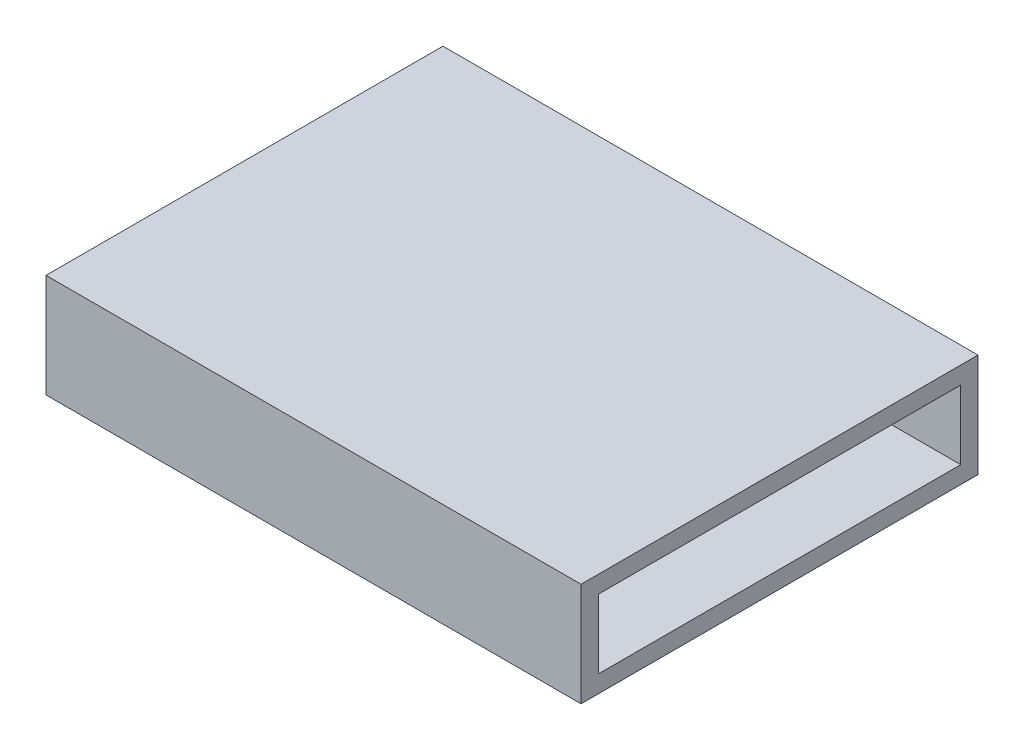
ISO-10303-21;
HEADER;
FILE_DESCRIPTION(('STEP AP214'),'2;1');
FILE_NAME('part.step','',(''),(''),'','','');
FILE_SCHEMA(('AUTOMOTIVE_DESIGN { 1 0 10303 214 1 1 1 1 }'));
ENDSEC;
DATA;
#1=APPLICATION_CONTEXT('core data for automotive mechanical design processes');
#2=APPLICATION_PROTOCOL_DEFINITION('international standard','automotive_design',2000,#1);
#3=PRODUCT_CONTEXT('',#1,'mechanical');
#4=PRODUCT('Part','Part','',(#3));
#5=PRODUCT_RELATED_PRODUCT_CATEGORY('part','',(#4));
#6=PRODUCT_DEFINITION_FORMATION('','',#4);
#7=PRODUCT_DEFINITION_CONTEXT('part definition',#1,'design');
#8=PRODUCT_DEFINITION('design','',#6,#7);
#9=PRODUCT_DEFINITION_SHAPE('','',#8);
#10=(LENGTH_UNIT() NAMED_UNIT(*) SI_UNIT(.MILLI.,.METRE.));
#11=(NAMED_UNIT(*) PLANE_ANGLE_UNIT() SI_UNIT($,.RADIAN.));
#12=(NAMED_UNIT(*) SI_UNIT($,.STERADIAN.) SOLID_ANGLE_UNIT());
#13=UNCERTAINTY_MEASURE_WITH_UNIT(LENGTH_MEASURE(1.E-05),#10,'distance_accuracy_value','');
#14=(GEOMETRIC_REPRESENTATION_CONTEXT(3) GLOBAL_UNCERTAINTY_ASSIGNED_CONTEXT((#13)) GLOBAL_UNIT_ASSIGNED_CONTEXT((#10,
#11,#12)) REPRESENTATION_CONTEXT('',''));
#15=CARTESIAN_POINT('',(0.,0.,0.));
#16=DIRECTION('',(0.,0.,1.));
#17=DIRECTION('',(1.,0.,0.));
#18=AXIS2_PLACEMENT_3D('',#15,#16,#17);
#19=CARTESIAN_POINT('',(0.,30.,0.));
#20=DIRECTION('',(1.,0.,0.));
#21=DIRECTION('',(0.,0.,-1.));
#22=AXIS2_PLACEMENT_3D('',#19,#20,#21);
#23=PLANE('',#22);
#24=DIRECTION('',(0.,-1.,0.));
#25=VECTOR('',#24,1.);
#26=CARTESIAN_POINT('',(0.,25.,-5.));
#27=LINE('',#26,#25);
#28=CARTESIAN_POINT('',(0.,25.,-5.));
#29=VERTEX_POINT('',#28);
#30=CARTESIAN_POINT('',(0.,5.,-5.));
#31=VERTEX_POINT('',#30);
#32=EDGE_CURVE('E118',#29,#31,#27,.T.);
#33=ORIENTED_EDGE('',*,*,#32,.T.);
#34=DIRECTION('',(0.,0.,-1.));
#35=VECTOR('',#34,1.);
#36=CARTESIAN_POINT('',(0.,5.,-5.));
#37=LINE('',#36,#35);
#38=CARTESIAN_POINT('',(0.,5.,-110.));
#39=VERTEX_POINT('',#38);
#40=EDGE_CURVE('E115',#31,#39,#37,.T.);
#41=ORIENTED_EDGE('',*,*,#40,.T.);
#42=DIRECTION('',(0.,1.,0.));
#43=VECTOR('',#42,1.);
#44=CARTESIAN_POINT('',(0.,5.,-110.));
#45=LINE('',#44,#43);
#46=CARTESIAN_POINT('',(0.,25.,-110.));
#47=VERTEX_POINT('',#46);
#48=EDGE_CURVE('E121',#39,#47,#45,.T.);
#49=ORIENTED_EDGE('',*,*,#48,.T.);
#50=DIRECTION('',(0.,0.,1.));
#51=VECTOR('',#50,1.);
#52=CARTESIAN_POINT('',(0.,25.,-110.));
#53=LINE('',#52,#51);
#54=EDGE_CURVE('E58',#47,#29,#53,.T.);
#55=ORIENTED_EDGE('',*,*,#54,.T.);
#56=EDGE_LOOP('',(#33,#41,#49,#55));
#57=FACE_BOUND('',#56,.T.);
#58=DIRECTION('',(0.,0.,1.));
#59=VECTOR('',#58,1.);
#60=CARTESIAN_POINT('',(0.,0.,0.));
#61=LINE('',#60,#59);
#62=CARTESIAN_POINT('',(0.,0.,-115.));
#63=VERTEX_POINT('',#62);
#64=CARTESIAN_POINT('',(0.,0.,0.));
#65=VERTEX_POINT('',#64);
#66=EDGE_CURVE('E153',#63,#65,#61,.T.);
#67=ORIENTED_EDGE('',*,*,#66,.T.);
#68=DIRECTION('',(0.,-1.,0.));
#69=VECTOR('',#68,1.);
#70=CARTESIAN_POINT('',(0.,30.,0.));
#71=LINE('',#70,#69);
#72=CARTESIAN_POINT('',(0.,30.,0.));
#73=VERTEX_POINT('',#72);
#74=EDGE_CURVE('E11',#73,#65,#71,.T.);
#75=ORIENTED_EDGE('',*,*,#74,.F.);
#76=DIRECTION('',(0.,0.,1.));
#77=VECTOR('',#76,1.);
#78=CARTESIAN_POINT('',(0.,30.,0.));
#79=LINE('',#78,#77);
#80=CARTESIAN_POINT('',(0.,30.,-115.));
#81=VERTEX_POINT('',#80);
#82=EDGE_CURVE('E157',#81,#73,#79,.T.);
#83=ORIENTED_EDGE('',*,*,#82,.F.);
#84=DIRECTION('',(0.,-1.,0.));
#85=VECTOR('',#84,1.);
#86=CARTESIAN_POINT('',(0.,30.,-115.));
#87=LINE('',#86,#85);
#88=EDGE_CURVE('E175',#81,#63,#87,.T.);
#89=ORIENTED_EDGE('',*,*,#88,.T.);
#90=EDGE_LOOP('',(#67,#75,#83,#89));
#91=FACE_BOUND('',#90,.T.);
#92=ADVANCED_FACE('F44',(#57,#91),#23,.F.);
#93=CARTESIAN_POINT('',(0.,30.,0.));
#94=DIRECTION('',(0.,0.,-1.));
#95=DIRECTION('',(-1.,0.,0.));
#96=AXIS2_PLACEMENT_3D('',#93,#94,#95);
#97=PLANE('',#96);
#98=DIRECTION('',(1.,0.,0.));
#99=VECTOR('',#98,1.);
#100=CARTESIAN_POINT('',(0.,0.,0.));
#101=LINE('',#100,#99);
#102=CARTESIAN_POINT('',(155.,0.,0.));
#103=VERTEX_POINT('',#102);
#104=EDGE_CURVE('E176',#65,#103,#101,.T.);
#105=ORIENTED_EDGE('',*,*,#104,.T.);
#106=DIRECTION('',(0.,-1.,0.));
#107=VECTOR('',#106,1.);
#108=CARTESIAN_POINT('',(155.,30.,0.));
#109=LINE('',#108,#107);
#110=CARTESIAN_POINT('',(155.,30.,0.));
#111=VERTEX_POINT('',#110);
#112=EDGE_CURVE('E52',#111,#103,#109,.T.);
#113=ORIENTED_EDGE('',*,*,#112,.F.);
#114=DIRECTION('',(1.,0.,0.));
#115=VECTOR('',#114,1.);
#116=CARTESIAN_POINT('',(0.,30.,0.));
#117=LINE('',#116,#115);
#118=EDGE_CURVE('E162',#73,#111,#117,.T.);
#119=ORIENTED_EDGE('',*,*,#118,.F.);
#120=ORIENTED_EDGE('',*,*,#74,.T.);
#121=EDGE_LOOP('',(#105,#113,#119,#120));
#122=FACE_BOUND('',#121,.T.);
#123=ADVANCED_FACE('F211',(#122),#97,.F.);
#124=CARTESIAN_POINT('',(155.,30.,0.));
#125=DIRECTION('',(-1.,0.,0.));
#126=DIRECTION('',(0.,0.,1.));
#127=AXIS2_PLACEMENT_3D('',#124,#125,#126);
#128=PLANE('',#127);
#129=DIRECTION('',(0.,1.,0.));
#130=VECTOR('',#129,1.);
#131=CARTESIAN_POINT('',(155.,5.,-110.));
#132=LINE('',#131,#130);
#133=CARTESIAN_POINT('',(155.,5.,-110.));
#134=VERTEX_POINT('',#133);
#135=CARTESIAN_POINT('',(155.,25.,-110.));
#136=VERTEX_POINT('',#135);
#137=EDGE_CURVE('E145',#134,#136,#132,.T.);
#138=ORIENTED_EDGE('',*,*,#137,.F.);
#139=DIRECTION('',(0.,0.,-1.));
#140=VECTOR('',#139,1.);
#141=CARTESIAN_POINT('',(155.,5.,-5.));
#142=LINE('',#141,#140);
#143=CARTESIAN_POINT('',(155.,5.,-5.));
#144=VERTEX_POINT('',#143);
#145=EDGE_CURVE('E70',#144,#134,#142,.T.);
#146=ORIENTED_EDGE('',*,*,#145,.F.);
#147=DIRECTION('',(0.,-1.,0.));
#148=VECTOR('',#147,1.);
#149=CARTESIAN_POINT('',(155.,25.,-5.));
#150=LINE('',#149,#148);
#151=CARTESIAN_POINT('',(155.,25.,-5.));
#152=VERTEX_POINT('',#151);
#153=EDGE_CURVE('E128',#152,#144,#150,.T.);
#154=ORIENTED_EDGE('',*,*,#153,.F.);
#155=DIRECTION('',(0.,0.,1.));
#156=VECTOR('',#155,1.);
#157=CARTESIAN_POINT('',(155.,25.,-110.));
#158=LINE('',#157,#156);
#159=EDGE_CURVE('E132',#136,#152,#158,.T.);
#160=ORIENTED_EDGE('',*,*,#159,.F.);
#161=EDGE_LOOP('',(#138,#146,#154,#160));
#162=FACE_BOUND('',#161,.T.);
#163=DIRECTION('',(0.,0.,-1.));
#164=VECTOR('',#163,1.);
#165=CARTESIAN_POINT('',(155.,0.,0.));
#166=LINE('',#165,#164);
#167=CARTESIAN_POINT('',(155.,0.,-115.));
#168=VERTEX_POINT('',#167);
#169=EDGE_CURVE('E177',#103,#168,#166,.T.);
#170=ORIENTED_EDGE('',*,*,#169,.T.);
#171=DIRECTION('',(0.,-1.,0.));
#172=VECTOR('',#171,1.);
#173=CARTESIAN_POINT('',(155.,30.,-115.));
#174=LINE('',#173,#172);
#175=CARTESIAN_POINT('',(155.,30.,-115.));
#176=VERTEX_POINT('',#175);
#177=EDGE_CURVE('E186',#176,#168,#174,.T.);
#178=ORIENTED_EDGE('',*,*,#177,.F.);
#179=DIRECTION('',(0.,0.,-1.));
#180=VECTOR('',#179,1.);
#181=CARTESIAN_POINT('',(155.,30.,0.));
#182=LINE('',#181,#180);
#183=EDGE_CURVE('E170',#111,#176,#182,.T.);
#184=ORIENTED_EDGE('',*,*,#183,.F.);
#185=ORIENTED_EDGE('',*,*,#112,.T.);
#186=EDGE_LOOP('',(#170,#178,#184,#185));
#187=FACE_BOUND('',#186,.T.);
#188=ADVANCED_FACE('F198',(#162,#187),#128,.F.);
#189=CARTESIAN_POINT('',(0.,30.,-115.));
#190=DIRECTION('',(0.,0.,1.));
#191=DIRECTION('',(1.,0.,0.));
#192=AXIS2_PLACEMENT_3D('',#189,#190,#191);
#193=PLANE('',#192);
#194=DIRECTION('',(-1.,0.,0.));
#195=VECTOR('',#194,1.);
#196=CARTESIAN_POINT('',(0.,0.,-115.));
#197=LINE('',#196,#195);
#198=EDGE_CURVE('E163',#168,#63,#197,.T.);
#199=ORIENTED_EDGE('',*,*,#198,.T.);
#200=ORIENTED_EDGE('',*,*,#88,.F.);
#201=DIRECTION('',(-1.,0.,0.));
#202=VECTOR('',#201,1.);
#203=CARTESIAN_POINT('',(0.,30.,-115.));
#204=LINE('',#203,#202);
#205=EDGE_CURVE('E168',#176,#81,#204,.T.);
#206=ORIENTED_EDGE('',*,*,#205,.F.);
#207=ORIENTED_EDGE('',*,*,#177,.T.);
#208=EDGE_LOOP('',(#199,#200,#206,#207));
#209=FACE_BOUND('',#208,.T.);
#210=ADVANCED_FACE('F202',(#209),#193,.F.);
#211=CARTESIAN_POINT('',(0.,30.,0.));
#212=DIRECTION('',(0.,-1.,0.));
#213=DIRECTION('',(0.,0.,-1.));
#214=AXIS2_PLACEMENT_3D('',#211,#212,#213);
#215=PLANE('',#214);
#216=ORIENTED_EDGE('',*,*,#82,.T.);
#217=ORIENTED_EDGE('',*,*,#118,.T.);
#218=ORIENTED_EDGE('',*,*,#183,.T.);
#219=ORIENTED_EDGE('',*,*,#205,.T.);
#220=EDGE_LOOP('',(#216,#217,#218,#219));
#221=FACE_BOUND('',#220,.T.);
#222=ADVANCED_FACE('F209',(#221),#215,.F.);
#223=CARTESIAN_POINT('',(0.,0.,0.));
#224=DIRECTION('',(0.,-1.,0.));
#225=DIRECTION('',(0.,0.,-1.));
#226=AXIS2_PLACEMENT_3D('',#223,#224,#225);
#227=PLANE('',#226);
#228=ORIENTED_EDGE('',*,*,#66,.F.);
#229=ORIENTED_EDGE('',*,*,#198,.F.);
#230=ORIENTED_EDGE('',*,*,#169,.F.);
#231=ORIENTED_EDGE('',*,*,#104,.F.);
#232=EDGE_LOOP('',(#228,#229,#230,#231));
#233=FACE_BOUND('',#232,.T.);
#234=ADVANCED_FACE('F205',(#233),#227,.T.);
#235=CARTESIAN_POINT('',(0.,5.,-5.));
#236=DIRECTION('',(0.,-1.,0.));
#237=DIRECTION('',(0.,0.,-1.));
#238=AXIS2_PLACEMENT_3D('',#235,#236,#237);
#239=PLANE('',#238);
#240=ORIENTED_EDGE('',*,*,#145,.T.);
#241=DIRECTION('',(1.,0.,0.));
#242=VECTOR('',#241,1.);
#243=CARTESIAN_POINT('',(0.,5.,-110.));
#244=LINE('',#243,#242);
#245=EDGE_CURVE('E107',#39,#134,#244,.T.);
#246=ORIENTED_EDGE('',*,*,#245,.F.);
#247=ORIENTED_EDGE('',*,*,#40,.F.);
#248=DIRECTION('',(1.,0.,0.));
#249=VECTOR('',#248,1.);
#250=CARTESIAN_POINT('',(0.,5.,-5.));
#251=LINE('',#250,#249);
#252=EDGE_CURVE('E147',#31,#144,#251,.T.);
#253=ORIENTED_EDGE('',*,*,#252,.T.);
#254=EDGE_LOOP('',(#240,#246,#247,#253));
#255=FACE_BOUND('',#254,.T.);
#256=ADVANCED_FACE('F109',(#255),#239,.F.);
#257=CARTESIAN_POINT('',(0.,25.,-5.));
#258=DIRECTION('',(0.,0.,1.));
#259=DIRECTION('',(1.,0.,0.));
#260=AXIS2_PLACEMENT_3D('',#257,#258,#259);
#261=PLANE('',#260);
#262=ORIENTED_EDGE('',*,*,#153,.T.);
#263=ORIENTED_EDGE('',*,*,#252,.F.);
#264=ORIENTED_EDGE('',*,*,#32,.F.);
#265=DIRECTION('',(1.,0.,0.));
#266=VECTOR('',#265,1.);
#267=CARTESIAN_POINT('',(0.,25.,-5.));
#268=LINE('',#267,#266);
#269=EDGE_CURVE('E152',#29,#152,#268,.T.);
#270=ORIENTED_EDGE('',*,*,#269,.T.);
#271=EDGE_LOOP('',(#262,#263,#264,#270));
#272=FACE_BOUND('',#271,.T.);
#273=ADVANCED_FACE('F226',(#272),#261,.F.);
#274=CARTESIAN_POINT('',(0.,25.,-110.));
#275=DIRECTION('',(0.,1.,0.));
#276=DIRECTION('',(0.,0.,1.));
#277=AXIS2_PLACEMENT_3D('',#274,#275,#276);
#278=PLANE('',#277);
#279=ORIENTED_EDGE('',*,*,#159,.T.);
#280=ORIENTED_EDGE('',*,*,#269,.F.);
#281=ORIENTED_EDGE('',*,*,#54,.F.);
#282=DIRECTION('',(1.,0.,0.));
#283=VECTOR('',#282,1.);
#284=CARTESIAN_POINT('',(0.,25.,-110.));
#285=LINE('',#284,#283);
#286=EDGE_CURVE('E120',#47,#136,#285,.T.);
#287=ORIENTED_EDGE('',*,*,#286,.T.);
#288=EDGE_LOOP('',(#279,#280,#281,#287));
#289=FACE_BOUND('',#288,.T.);
#290=ADVANCED_FACE('F227',(#289),#278,.F.);
#291=CARTESIAN_POINT('',(0.,5.,-110.));
#292=DIRECTION('',(0.,0.,-1.));
#293=DIRECTION('',(-1.,0.,0.));
#294=AXIS2_PLACEMENT_3D('',#291,#292,#293);
#295=PLANE('',#294);
#296=ORIENTED_EDGE('',*,*,#137,.T.);
#297=ORIENTED_EDGE('',*,*,#286,.F.);
#298=ORIENTED_EDGE('',*,*,#48,.F.);
#299=ORIENTED_EDGE('',*,*,#245,.T.);
#300=EDGE_LOOP('',(#296,#297,#298,#299));
#301=FACE_BOUND('',#300,.T.);
#302=ADVANCED_FACE('F125',(#301),#295,.F.);
#303=CLOSED_SHELL('',(#92,#123,#188,#210,#222,#234,#256,#273,#290,#302));
#304=MANIFOLD_SOLID_BREP('B2',#303);
#305=ADVANCED_BREP_SHAPE_REPRESENTATION('',(#18,#304),#14);
#306=SHAPE_DEFINITION_REPRESENTATION(#9,#305);
ENDSEC;
END-ISO-10303-21;
